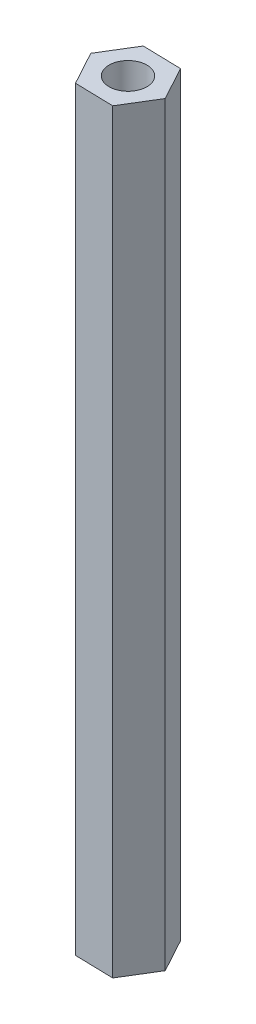
ISO-10303-21;
HEADER;
FILE_DESCRIPTION(('STEP AP214'),'2;1');
FILE_NAME('part.step','',(''),(''),'','','');
FILE_SCHEMA(('AUTOMOTIVE_DESIGN { 1 0 10303 214 1 1 1 1 }'));
ENDSEC;
DATA;
#1=APPLICATION_CONTEXT('core data for automotive mechanical design processes');
#2=APPLICATION_PROTOCOL_DEFINITION('international standard','automotive_design',2000,#1);
#3=PRODUCT_CONTEXT('',#1,'mechanical');
#4=PRODUCT('Part','Part','',(#3));
#5=PRODUCT_RELATED_PRODUCT_CATEGORY('part','',(#4));
#6=PRODUCT_DEFINITION_FORMATION('','',#4);
#7=PRODUCT_DEFINITION_CONTEXT('part definition',#1,'design');
#8=PRODUCT_DEFINITION('design','',#6,#7);
#9=PRODUCT_DEFINITION_SHAPE('','',#8);
#10=(LENGTH_UNIT() NAMED_UNIT(*) SI_UNIT(.MILLI.,.METRE.));
#11=(NAMED_UNIT(*) PLANE_ANGLE_UNIT() SI_UNIT($,.RADIAN.));
#12=(NAMED_UNIT(*) SI_UNIT($,.STERADIAN.) SOLID_ANGLE_UNIT());
#13=UNCERTAINTY_MEASURE_WITH_UNIT(LENGTH_MEASURE(1.E-05),#10,'distance_accuracy_value','');
#14=(GEOMETRIC_REPRESENTATION_CONTEXT(3) GLOBAL_UNCERTAINTY_ASSIGNED_CONTEXT((#13)) GLOBAL_UNIT_ASSIGNED_CONTEXT((#10,
#11,#12)) REPRESENTATION_CONTEXT('',''));
#15=CARTESIAN_POINT('',(0.,0.,0.));
#16=DIRECTION('',(0.,0.,1.));
#17=DIRECTION('',(1.,0.,0.));
#18=AXIS2_PLACEMENT_3D('',#15,#16,#17);
#19=CARTESIAN_POINT('',(0.,60.,0.));
#20=DIRECTION('',(0.,1.,0.));
#21=DIRECTION('',(0.,0.,1.));
#22=AXIS2_PLACEMENT_3D('',#19,#20,#21);
#23=PLANE('',#22);
#24=DIRECTION('',(-0.477820878942088,0.,-0.878457288459155));
#25=VECTOR('',#24,1.);
#26=CARTESIAN_POINT('',(3.03311312868402,60.,0.0771376629807));
#27=LINE('',#26,#25);
#28=CARTESIAN_POINT('',(3.03311312868402,60.,0.0771376629807));
#29=VERTEX_POINT('',#28);
#30=CARTESIAN_POINT('',(1.58335974007186,60.,-2.58818419050211));
#31=VERTEX_POINT('',#30);
#32=EDGE_CURVE('E146',#29,#31,#27,.T.);
#33=ORIENTED_EDGE('',*,*,#32,.T.);
#34=DIRECTION('',(-0.999676767416267,0.,-0.0254236246071209));
#35=VECTOR('',#34,1.);
#36=CARTESIAN_POINT('',(1.58335974007186,60.,-2.58818419050211));
#37=LINE('',#36,#35);
#38=CARTESIAN_POINT('',(-1.44975338861216,60.,-2.66532185348281));
#39=VERTEX_POINT('',#38);
#40=EDGE_CURVE('E94',#31,#39,#37,.T.);
#41=ORIENTED_EDGE('',*,*,#40,.T.);
#42=DIRECTION('',(-0.521855888474179,0.,0.853033663852034));
#43=VECTOR('',#42,1.);
#44=CARTESIAN_POINT('',(-1.44975338861216,60.,-2.66532185348281));
#45=LINE('',#44,#43);
#46=CARTESIAN_POINT('',(-3.03311312868402,60.,-0.0771376629807));
#47=VERTEX_POINT('',#46);
#48=EDGE_CURVE('E107',#39,#47,#45,.T.);
#49=ORIENTED_EDGE('',*,*,#48,.T.);
#50=DIRECTION('',(0.477820878942088,0.,0.878457288459155));
#51=VECTOR('',#50,1.);
#52=CARTESIAN_POINT('',(-3.03311312868402,60.,-0.0771376629807));
#53=LINE('',#52,#51);
#54=CARTESIAN_POINT('',(-1.58335974007186,60.,2.58818419050211));
#55=VERTEX_POINT('',#54);
#56=EDGE_CURVE('E101',#47,#55,#53,.T.);
#57=ORIENTED_EDGE('',*,*,#56,.T.);
#58=DIRECTION('',(0.999676767416267,0.,0.0254236246071206));
#59=VECTOR('',#58,1.);
#60=CARTESIAN_POINT('',(-1.58335974007186,60.,2.58818419050211));
#61=LINE('',#60,#59);
#62=CARTESIAN_POINT('',(1.44975338861216,60.,2.66532185348281));
#63=VERTEX_POINT('',#62);
#64=EDGE_CURVE('E105',#55,#63,#61,.T.);
#65=ORIENTED_EDGE('',*,*,#64,.T.);
#66=DIRECTION('',(0.521855888474179,0.,-0.853033663852034));
#67=VECTOR('',#66,1.);
#68=CARTESIAN_POINT('',(1.44975338861216,60.,2.66532185348281));
#69=LINE('',#68,#67);
#70=EDGE_CURVE('E57',#63,#29,#69,.T.);
#71=ORIENTED_EDGE('',*,*,#70,.T.);
#72=EDGE_LOOP('',(#33,#41,#49,#57,#65,#71));
#73=FACE_BOUND('',#72,.T.);
#74=CARTESIAN_POINT('',(0.,60.,0.));
#75=DIRECTION('',(0.,1.,0.));
#76=DIRECTION('',(0.,0.,1.));
#77=AXIS2_PLACEMENT_3D('',#74,#75,#76);
#78=CIRCLE('',#77,1.5);
#79=CARTESIAN_POINT('',(0.,60.,1.5));
#80=VERTEX_POINT('',#79);
#81=EDGE_CURVE('E134',#80,#80,#78,.T.);
#82=ORIENTED_EDGE('',*,*,#81,.F.);
#83=EDGE_LOOP('',(#82));
#84=FACE_BOUND('',#83,.T.);
#85=ADVANCED_FACE('F39',(#73,#84),#23,.T.);
#86=CARTESIAN_POINT('',(0.,0.,0.));
#87=DIRECTION('',(0.,1.,0.));
#88=DIRECTION('',(0.,0.,1.));
#89=AXIS2_PLACEMENT_3D('',#86,#87,#88);
#90=PLANE('',#89);
#91=DIRECTION('',(-0.477820878942088,0.,-0.878457288459155));
#92=VECTOR('',#91,1.);
#93=CARTESIAN_POINT('',(3.03311312868402,0.,0.0771376629807));
#94=LINE('',#93,#92);
#95=CARTESIAN_POINT('',(3.03311312868402,0.,0.0771376629807));
#96=VERTEX_POINT('',#95);
#97=CARTESIAN_POINT('',(1.58335974007186,0.,-2.58818419050211));
#98=VERTEX_POINT('',#97);
#99=EDGE_CURVE('E129',#96,#98,#94,.T.);
#100=ORIENTED_EDGE('',*,*,#99,.F.);
#101=DIRECTION('',(0.521855888474179,0.,-0.853033663852034));
#102=VECTOR('',#101,1.);
#103=CARTESIAN_POINT('',(1.44975338861216,0.,2.66532185348281));
#104=LINE('',#103,#102);
#105=CARTESIAN_POINT('',(1.44975338861216,0.,2.66532185348281));
#106=VERTEX_POINT('',#105);
#107=EDGE_CURVE('E86',#106,#96,#104,.T.);
#108=ORIENTED_EDGE('',*,*,#107,.F.);
#109=DIRECTION('',(0.999676767416267,0.,0.0254236246071206));
#110=VECTOR('',#109,1.);
#111=CARTESIAN_POINT('',(-1.58335974007186,0.,2.58818419050211));
#112=LINE('',#111,#110);
#113=CARTESIAN_POINT('',(-1.58335974007186,0.,2.58818419050211));
#114=VERTEX_POINT('',#113);
#115=EDGE_CURVE('E80',#114,#106,#112,.T.);
#116=ORIENTED_EDGE('',*,*,#115,.F.);
#117=DIRECTION('',(0.477820878942088,0.,0.878457288459155));
#118=VECTOR('',#117,1.);
#119=CARTESIAN_POINT('',(-3.03311312868402,0.,-0.0771376629807));
#120=LINE('',#119,#118);
#121=CARTESIAN_POINT('',(-3.03311312868402,0.,-0.0771376629807));
#122=VERTEX_POINT('',#121);
#123=EDGE_CURVE('E116',#122,#114,#120,.T.);
#124=ORIENTED_EDGE('',*,*,#123,.F.);
#125=DIRECTION('',(-0.521855888474179,0.,0.853033663852034));
#126=VECTOR('',#125,1.);
#127=CARTESIAN_POINT('',(-1.44975338861216,0.,-2.66532185348281));
#128=LINE('',#127,#126);
#129=CARTESIAN_POINT('',(-1.44975338861216,0.,-2.66532185348281));
#130=VERTEX_POINT('',#129);
#131=EDGE_CURVE('E137',#130,#122,#128,.T.);
#132=ORIENTED_EDGE('',*,*,#131,.F.);
#133=DIRECTION('',(-0.999676767416267,0.,-0.0254236246071209));
#134=VECTOR('',#133,1.);
#135=CARTESIAN_POINT('',(1.58335974007186,0.,-2.58818419050211));
#136=LINE('',#135,#134);
#137=EDGE_CURVE('E133',#98,#130,#136,.T.);
#138=ORIENTED_EDGE('',*,*,#137,.F.);
#139=EDGE_LOOP('',(#100,#108,#116,#124,#132,#138));
#140=FACE_BOUND('',#139,.T.);
#141=CARTESIAN_POINT('',(0.,0.,0.));
#142=DIRECTION('',(0.,1.,0.));
#143=DIRECTION('',(0.,0.,1.));
#144=AXIS2_PLACEMENT_3D('',#141,#142,#143);
#145=CIRCLE('',#144,1.5);
#146=CARTESIAN_POINT('',(0.,0.,1.5));
#147=VERTEX_POINT('',#146);
#148=EDGE_CURVE('E243',#147,#147,#145,.T.);
#149=ORIENTED_EDGE('',*,*,#148,.T.);
#150=EDGE_LOOP('',(#149));
#151=FACE_BOUND('',#150,.T.);
#152=ADVANCED_FACE('F159',(#140,#151),#90,.F.);
#153=CARTESIAN_POINT('',(3.03311312868402,60.,0.0771376629807));
#154=DIRECTION('',(-0.878457288459155,0.,0.477820878942087));
#155=DIRECTION('',(0.477820878942088,0.,0.878457288459155));
#156=AXIS2_PLACEMENT_3D('',#153,#154,#155);
#157=PLANE('',#156);
#158=ORIENTED_EDGE('',*,*,#99,.T.);
#159=DIRECTION('',(0.,-1.,0.));
#160=VECTOR('',#159,1.);
#161=CARTESIAN_POINT('',(1.58335974007186,60.,-2.58818419050211));
#162=LINE('',#161,#160);
#163=EDGE_CURVE('E11',#31,#98,#162,.T.);
#164=ORIENTED_EDGE('',*,*,#163,.F.);
#165=ORIENTED_EDGE('',*,*,#32,.F.);
#166=DIRECTION('',(0.,-1.,0.));
#167=VECTOR('',#166,1.);
#168=CARTESIAN_POINT('',(3.03311312868402,60.,0.0771376629807));
#169=LINE('',#168,#167);
#170=EDGE_CURVE('E125',#29,#96,#169,.T.);
#171=ORIENTED_EDGE('',*,*,#170,.T.);
#172=EDGE_LOOP('',(#158,#164,#165,#171));
#173=FACE_BOUND('',#172,.T.);
#174=ADVANCED_FACE('F41',(#173),#157,.F.);
#175=CARTESIAN_POINT('',(1.58335974007186,60.,-2.58818419050211));
#176=DIRECTION('',(-0.0254236246071209,0.,0.999676767416267));
#177=DIRECTION('',(0.999676767416267,0.,0.0254236246071209));
#178=AXIS2_PLACEMENT_3D('',#175,#176,#177);
#179=PLANE('',#178);
#180=ORIENTED_EDGE('',*,*,#137,.T.);
#181=DIRECTION('',(0.,-1.,0.));
#182=VECTOR('',#181,1.);
#183=CARTESIAN_POINT('',(-1.44975338861216,60.,-2.66532185348281));
#184=LINE('',#183,#182);
#185=EDGE_CURVE('E49',#39,#130,#184,.T.);
#186=ORIENTED_EDGE('',*,*,#185,.F.);
#187=ORIENTED_EDGE('',*,*,#40,.F.);
#188=ORIENTED_EDGE('',*,*,#163,.T.);
#189=EDGE_LOOP('',(#180,#186,#187,#188));
#190=FACE_BOUND('',#189,.T.);
#191=ADVANCED_FACE('F184',(#190),#179,.F.);
#192=CARTESIAN_POINT('',(-1.44975338861216,60.,-2.66532185348281));
#193=DIRECTION('',(0.853033663852034,0.,0.521855888474179));
#194=DIRECTION('',(0.521855888474179,0.,-0.853033663852034));
#195=AXIS2_PLACEMENT_3D('',#192,#193,#194);
#196=PLANE('',#195);
#197=ORIENTED_EDGE('',*,*,#131,.T.);
#198=DIRECTION('',(0.,-1.,0.));
#199=VECTOR('',#198,1.);
#200=CARTESIAN_POINT('',(-3.03311312868402,60.,-0.0771376629807));
#201=LINE('',#200,#199);
#202=EDGE_CURVE('E118',#47,#122,#201,.T.);
#203=ORIENTED_EDGE('',*,*,#202,.F.);
#204=ORIENTED_EDGE('',*,*,#48,.F.);
#205=ORIENTED_EDGE('',*,*,#185,.T.);
#206=EDGE_LOOP('',(#197,#203,#204,#205));
#207=FACE_BOUND('',#206,.T.);
#208=ADVANCED_FACE('F156',(#207),#196,.F.);
#209=CARTESIAN_POINT('',(-3.03311312868402,60.,-0.0771376629807));
#210=DIRECTION('',(0.878457288459155,0.,-0.477820878942088));
#211=DIRECTION('',(-0.477820878942088,0.,-0.878457288459155));
#212=AXIS2_PLACEMENT_3D('',#209,#210,#211);
#213=PLANE('',#212);
#214=ORIENTED_EDGE('',*,*,#123,.T.);
#215=DIRECTION('',(0.,-1.,0.));
#216=VECTOR('',#215,1.);
#217=CARTESIAN_POINT('',(-1.58335974007186,60.,2.58818419050211));
#218=LINE('',#217,#216);
#219=EDGE_CURVE('E113',#55,#114,#218,.T.);
#220=ORIENTED_EDGE('',*,*,#219,.F.);
#221=ORIENTED_EDGE('',*,*,#56,.F.);
#222=ORIENTED_EDGE('',*,*,#202,.T.);
#223=EDGE_LOOP('',(#214,#220,#221,#222));
#224=FACE_BOUND('',#223,.T.);
#225=ADVANCED_FACE('F114',(#224),#213,.F.);
#226=CARTESIAN_POINT('',(-1.58335974007186,60.,2.58818419050211));
#227=DIRECTION('',(0.0254236246071206,0.,-0.999676767416266));
#228=DIRECTION('',(-0.999676767416267,0.,-0.0254236246071206));
#229=AXIS2_PLACEMENT_3D('',#226,#227,#228);
#230=PLANE('',#229);
#231=ORIENTED_EDGE('',*,*,#115,.T.);
#232=DIRECTION('',(0.,-1.,0.));
#233=VECTOR('',#232,1.);
#234=CARTESIAN_POINT('',(1.44975338861216,60.,2.66532185348281));
#235=LINE('',#234,#233);
#236=EDGE_CURVE('E119',#63,#106,#235,.T.);
#237=ORIENTED_EDGE('',*,*,#236,.F.);
#238=ORIENTED_EDGE('',*,*,#64,.F.);
#239=ORIENTED_EDGE('',*,*,#219,.T.);
#240=EDGE_LOOP('',(#231,#237,#238,#239));
#241=FACE_BOUND('',#240,.T.);
#242=ADVANCED_FACE('F121',(#241),#230,.F.);
#243=CARTESIAN_POINT('',(1.44975338861216,60.,2.66532185348281));
#244=DIRECTION('',(-0.853033663852034,0.,-0.521855888474179));
#245=DIRECTION('',(-0.521855888474179,0.,0.853033663852034));
#246=AXIS2_PLACEMENT_3D('',#243,#244,#245);
#247=PLANE('',#246);
#248=ORIENTED_EDGE('',*,*,#107,.T.);
#249=ORIENTED_EDGE('',*,*,#170,.F.);
#250=ORIENTED_EDGE('',*,*,#70,.F.);
#251=ORIENTED_EDGE('',*,*,#236,.T.);
#252=EDGE_LOOP('',(#248,#249,#250,#251));
#253=FACE_BOUND('',#252,.T.);
#254=ADVANCED_FACE('F164',(#253),#247,.F.);
#255=CARTESIAN_POINT('',(0.,60.,0.));
#256=DIRECTION('',(0.,-1.,0.));
#257=DIRECTION('',(0.,0.,-1.));
#258=AXIS2_PLACEMENT_3D('',#255,#256,#257);
#259=CYLINDRICAL_SURFACE('',#258,1.5);
#260=ORIENTED_EDGE('',*,*,#81,.T.);
#261=EDGE_LOOP('',(#260));
#262=FACE_BOUND('',#261,.T.);
#263=ORIENTED_EDGE('',*,*,#148,.F.);
#264=EDGE_LOOP('',(#263));
#265=FACE_BOUND('',#264,.T.);
#266=ADVANCED_FACE('F166',(#262,#265),#259,.F.);
#267=CLOSED_SHELL('',(#85,#152,#174,#191,#208,#225,#242,#254,#266));
#268=MANIFOLD_SOLID_BREP('B2',#267);
#269=ADVANCED_BREP_SHAPE_REPRESENTATION('',(#18,#268),#14);
#270=SHAPE_DEFINITION_REPRESENTATION(#9,#269);
ENDSEC;
END-ISO-10303-21;
